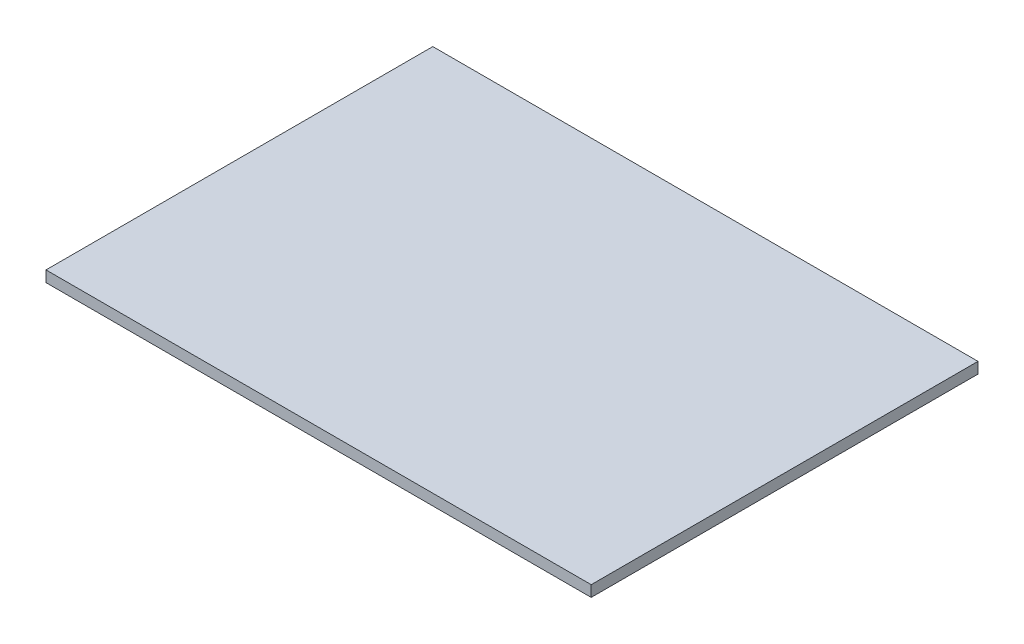
ISO-10303-21;
HEADER;
FILE_DESCRIPTION(('STEP AP214'),'2;1');
FILE_NAME('part.step','',(''),(''),'','','');
FILE_SCHEMA(('AUTOMOTIVE_DESIGN { 1 0 10303 214 1 1 1 1 }'));
ENDSEC;
DATA;
#1=APPLICATION_CONTEXT('core data for automotive mechanical design processes');
#2=APPLICATION_PROTOCOL_DEFINITION('international standard','automotive_design',2000,#1);
#3=PRODUCT_CONTEXT('',#1,'mechanical');
#4=PRODUCT('Part','Part','',(#3));
#5=PRODUCT_RELATED_PRODUCT_CATEGORY('part','',(#4));
#6=PRODUCT_DEFINITION_FORMATION('','',#4);
#7=PRODUCT_DEFINITION_CONTEXT('part definition',#1,'design');
#8=PRODUCT_DEFINITION('design','',#6,#7);
#9=PRODUCT_DEFINITION_SHAPE('','',#8);
#10=(LENGTH_UNIT() NAMED_UNIT(*) SI_UNIT(.MILLI.,.METRE.));
#11=(NAMED_UNIT(*) PLANE_ANGLE_UNIT() SI_UNIT($,.RADIAN.));
#12=(NAMED_UNIT(*) SI_UNIT($,.STERADIAN.) SOLID_ANGLE_UNIT());
#13=UNCERTAINTY_MEASURE_WITH_UNIT(LENGTH_MEASURE(1.E-05),#10,'distance_accuracy_value','');
#14=(GEOMETRIC_REPRESENTATION_CONTEXT(3) GLOBAL_UNCERTAINTY_ASSIGNED_CONTEXT((#13)) GLOBAL_UNIT_ASSIGNED_CONTEXT((#10,
#11,#12)) REPRESENTATION_CONTEXT('',''));
#15=CARTESIAN_POINT('',(0.,0.,0.));
#16=DIRECTION('',(0.,0.,1.));
#17=DIRECTION('',(1.,0.,0.));
#18=AXIS2_PLACEMENT_3D('',#15,#16,#17);
#19=CARTESIAN_POINT('',(0.,3.,0.));
#20=DIRECTION('',(1.,0.,0.));
#21=DIRECTION('',(0.,0.,-1.));
#22=AXIS2_PLACEMENT_3D('',#19,#20,#21);
#23=PLANE('',#22);
#24=DIRECTION('',(0.,0.,1.));
#25=VECTOR('',#24,1.);
#26=CARTESIAN_POINT('',(0.,0.,0.));
#27=LINE('',#26,#25);
#28=CARTESIAN_POINT('',(0.,0.,-105.));
#29=VERTEX_POINT('',#28);
#30=CARTESIAN_POINT('',(0.,0.,0.));
#31=VERTEX_POINT('',#30);
#32=EDGE_CURVE('E96',#29,#31,#27,.T.);
#33=ORIENTED_EDGE('',*,*,#32,.T.);
#34=DIRECTION('',(0.,-1.,0.));
#35=VECTOR('',#34,1.);
#36=CARTESIAN_POINT('',(0.,3.,0.));
#37=LINE('',#36,#35);
#38=CARTESIAN_POINT('',(0.,3.,0.));
#39=VERTEX_POINT('',#38);
#40=EDGE_CURVE('E11',#39,#31,#37,.T.);
#41=ORIENTED_EDGE('',*,*,#40,.F.);
#42=DIRECTION('',(0.,0.,1.));
#43=VECTOR('',#42,1.);
#44=CARTESIAN_POINT('',(0.,3.,0.));
#45=LINE('',#44,#43);
#46=CARTESIAN_POINT('',(0.,3.,-105.));
#47=VERTEX_POINT('',#46);
#48=EDGE_CURVE('E84',#47,#39,#45,.T.);
#49=ORIENTED_EDGE('',*,*,#48,.F.);
#50=DIRECTION('',(0.,-1.,0.));
#51=VECTOR('',#50,1.);
#52=CARTESIAN_POINT('',(0.,3.,-105.));
#53=LINE('',#52,#51);
#54=EDGE_CURVE('E92',#47,#29,#53,.T.);
#55=ORIENTED_EDGE('',*,*,#54,.T.);
#56=EDGE_LOOP('',(#33,#41,#49,#55));
#57=FACE_BOUND('',#56,.T.);
#58=ADVANCED_FACE('F33',(#57),#23,.F.);
#59=CARTESIAN_POINT('',(0.,3.,0.));
#60=DIRECTION('',(0.,0.,-1.));
#61=DIRECTION('',(-1.,0.,0.));
#62=AXIS2_PLACEMENT_3D('',#59,#60,#61);
#63=PLANE('',#62);
#64=DIRECTION('',(1.,0.,0.));
#65=VECTOR('',#64,1.);
#66=CARTESIAN_POINT('',(0.,0.,0.));
#67=LINE('',#66,#65);
#68=CARTESIAN_POINT('',(148.,0.,0.));
#69=VERTEX_POINT('',#68);
#70=EDGE_CURVE('E88',#31,#69,#67,.T.);
#71=ORIENTED_EDGE('',*,*,#70,.T.);
#72=DIRECTION('',(0.,-1.,0.));
#73=VECTOR('',#72,1.);
#74=CARTESIAN_POINT('',(148.,3.,0.));
#75=LINE('',#74,#73);
#76=CARTESIAN_POINT('',(148.,3.,0.));
#77=VERTEX_POINT('',#76);
#78=EDGE_CURVE('E41',#77,#69,#75,.T.);
#79=ORIENTED_EDGE('',*,*,#78,.F.);
#80=DIRECTION('',(1.,0.,0.));
#81=VECTOR('',#80,1.);
#82=CARTESIAN_POINT('',(0.,3.,0.));
#83=LINE('',#82,#81);
#84=EDGE_CURVE('E79',#39,#77,#83,.T.);
#85=ORIENTED_EDGE('',*,*,#84,.F.);
#86=ORIENTED_EDGE('',*,*,#40,.T.);
#87=EDGE_LOOP('',(#71,#79,#85,#86));
#88=FACE_BOUND('',#87,.T.);
#89=ADVANCED_FACE('F87',(#88),#63,.F.);
#90=CARTESIAN_POINT('',(148.,3.,0.));
#91=DIRECTION('',(-1.,0.,0.));
#92=DIRECTION('',(0.,0.,1.));
#93=AXIS2_PLACEMENT_3D('',#90,#91,#92);
#94=PLANE('',#93);
#95=DIRECTION('',(0.,0.,-1.));
#96=VECTOR('',#95,1.);
#97=CARTESIAN_POINT('',(148.,0.,0.));
#98=LINE('',#97,#96);
#99=CARTESIAN_POINT('',(148.,0.,-105.));
#100=VERTEX_POINT('',#99);
#101=EDGE_CURVE('E66',#69,#100,#98,.T.);
#102=ORIENTED_EDGE('',*,*,#101,.T.);
#103=DIRECTION('',(0.,-1.,0.));
#104=VECTOR('',#103,1.);
#105=CARTESIAN_POINT('',(148.,3.,-105.));
#106=LINE('',#105,#104);
#107=CARTESIAN_POINT('',(148.,3.,-105.));
#108=VERTEX_POINT('',#107);
#109=EDGE_CURVE('E89',#108,#100,#106,.T.);
#110=ORIENTED_EDGE('',*,*,#109,.F.);
#111=DIRECTION('',(0.,0.,-1.));
#112=VECTOR('',#111,1.);
#113=CARTESIAN_POINT('',(148.,3.,0.));
#114=LINE('',#113,#112);
#115=EDGE_CURVE('E82',#77,#108,#114,.T.);
#116=ORIENTED_EDGE('',*,*,#115,.F.);
#117=ORIENTED_EDGE('',*,*,#78,.T.);
#118=EDGE_LOOP('',(#102,#110,#116,#117));
#119=FACE_BOUND('',#118,.T.);
#120=ADVANCED_FACE('F90',(#119),#94,.F.);
#121=CARTESIAN_POINT('',(0.,3.,-105.));
#122=DIRECTION('',(0.,0.,1.));
#123=DIRECTION('',(1.,0.,0.));
#124=AXIS2_PLACEMENT_3D('',#121,#122,#123);
#125=PLANE('',#124);
#126=DIRECTION('',(-1.,0.,0.));
#127=VECTOR('',#126,1.);
#128=CARTESIAN_POINT('',(0.,0.,-105.));
#129=LINE('',#128,#127);
#130=EDGE_CURVE('E72',#100,#29,#129,.T.);
#131=ORIENTED_EDGE('',*,*,#130,.T.);
#132=ORIENTED_EDGE('',*,*,#54,.F.);
#133=DIRECTION('',(-1.,0.,0.));
#134=VECTOR('',#133,1.);
#135=CARTESIAN_POINT('',(0.,3.,-105.));
#136=LINE('',#135,#134);
#137=EDGE_CURVE('E49',#108,#47,#136,.T.);
#138=ORIENTED_EDGE('',*,*,#137,.F.);
#139=ORIENTED_EDGE('',*,*,#109,.T.);
#140=EDGE_LOOP('',(#131,#132,#138,#139));
#141=FACE_BOUND('',#140,.T.);
#142=ADVANCED_FACE('F103',(#141),#125,.F.);
#143=CARTESIAN_POINT('',(0.,3.,0.));
#144=DIRECTION('',(0.,-1.,0.));
#145=DIRECTION('',(0.,0.,-1.));
#146=AXIS2_PLACEMENT_3D('',#143,#144,#145);
#147=PLANE('',#146);
#148=ORIENTED_EDGE('',*,*,#48,.T.);
#149=ORIENTED_EDGE('',*,*,#84,.T.);
#150=ORIENTED_EDGE('',*,*,#115,.T.);
#151=ORIENTED_EDGE('',*,*,#137,.T.);
#152=EDGE_LOOP('',(#148,#149,#150,#151));
#153=FACE_BOUND('',#152,.T.);
#154=ADVANCED_FACE('F80',(#153),#147,.F.);
#155=CARTESIAN_POINT('',(0.,0.,0.));
#156=DIRECTION('',(0.,-1.,0.));
#157=DIRECTION('',(0.,0.,-1.));
#158=AXIS2_PLACEMENT_3D('',#155,#156,#157);
#159=PLANE('',#158);
#160=ORIENTED_EDGE('',*,*,#32,.F.);
#161=ORIENTED_EDGE('',*,*,#130,.F.);
#162=ORIENTED_EDGE('',*,*,#101,.F.);
#163=ORIENTED_EDGE('',*,*,#70,.F.);
#164=EDGE_LOOP('',(#160,#161,#162,#163));
#165=FACE_BOUND('',#164,.T.);
#166=ADVANCED_FACE('F106',(#165),#159,.T.);
#167=CLOSED_SHELL('',(#58,#89,#120,#142,#154,#166));
#168=MANIFOLD_SOLID_BREP('B2',#167);
#169=ADVANCED_BREP_SHAPE_REPRESENTATION('',(#18,#168),#14);
#170=SHAPE_DEFINITION_REPRESENTATION(#9,#169);
ENDSEC;
END-ISO-10303-21;
